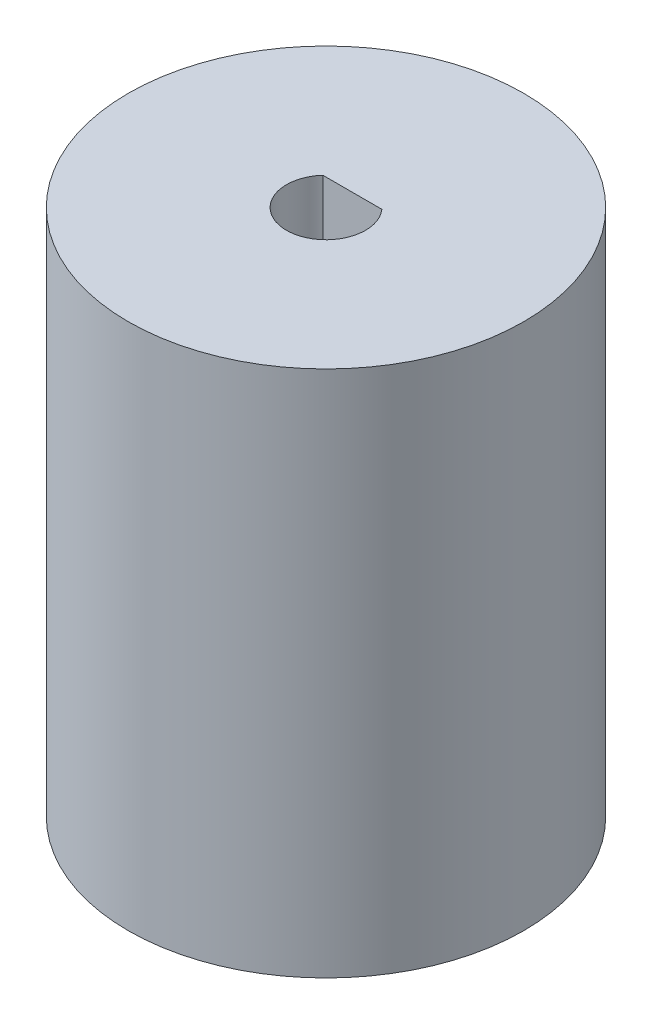
ISO-10303-21;
HEADER;
FILE_DESCRIPTION(('STEP AP214'),'2;1');
FILE_NAME('part.step','',(''),(''),'','','');
FILE_SCHEMA(('AUTOMOTIVE_DESIGN { 1 0 10303 214 1 1 1 1 }'));
ENDSEC;
DATA;
#1=APPLICATION_CONTEXT('core data for automotive mechanical design processes');
#2=APPLICATION_PROTOCOL_DEFINITION('international standard','automotive_design',2000,#1);
#3=PRODUCT_CONTEXT('',#1,'mechanical');
#4=PRODUCT('Part','Part','',(#3));
#5=PRODUCT_RELATED_PRODUCT_CATEGORY('part','',(#4));
#6=PRODUCT_DEFINITION_FORMATION('','',#4);
#7=PRODUCT_DEFINITION_CONTEXT('part definition',#1,'design');
#8=PRODUCT_DEFINITION('design','',#6,#7);
#9=PRODUCT_DEFINITION_SHAPE('','',#8);
#10=(LENGTH_UNIT() NAMED_UNIT(*) SI_UNIT(.MILLI.,.METRE.));
#11=(NAMED_UNIT(*) PLANE_ANGLE_UNIT() SI_UNIT($,.RADIAN.));
#12=(NAMED_UNIT(*) SI_UNIT($,.STERADIAN.) SOLID_ANGLE_UNIT());
#13=UNCERTAINTY_MEASURE_WITH_UNIT(LENGTH_MEASURE(1.E-05),#10,'distance_accuracy_value','');
#14=(GEOMETRIC_REPRESENTATION_CONTEXT(3) GLOBAL_UNCERTAINTY_ASSIGNED_CONTEXT((#13)) GLOBAL_UNIT_ASSIGNED_CONTEXT((#10,
#11,#12)) REPRESENTATION_CONTEXT('',''));
#15=CARTESIAN_POINT('',(0.,0.,0.));
#16=DIRECTION('',(0.,0.,1.));
#17=DIRECTION('',(1.,0.,0.));
#18=AXIS2_PLACEMENT_3D('',#15,#16,#17);
#19=CARTESIAN_POINT('',(0.,20.,0.247872528));
#20=DIRECTION('',(0.,0.,-1.));
#21=DIRECTION('',(-1.,0.,0.));
#22=AXIS2_PLACEMENT_3D('',#19,#20,#21);
#23=PLANE('',#22);
#24=DIRECTION('',(1.,0.,0.));
#25=VECTOR('',#24,1.);
#26=CARTESIAN_POINT('',(0.,0.,0.247872528));
#27=LINE('',#26,#25);
#28=CARTESIAN_POINT('',(-1.11803398874989,0.,0.247872528));
#29=VERTEX_POINT('',#28);
#30=CARTESIAN_POINT('',(1.1180339887499,0.,0.247872528));
#31=VERTEX_POINT('',#30);
#32=EDGE_CURVE('E59',#29,#31,#27,.T.);
#33=ORIENTED_EDGE('',*,*,#32,.T.);
#34=DIRECTION('',(0.,-1.,0.));
#35=VECTOR('',#34,1.);
#36=CARTESIAN_POINT('',(1.1180339887499,20.,0.247872528));
#37=LINE('',#36,#35);
#38=CARTESIAN_POINT('',(1.1180339887499,20.,0.247872528));
#39=VERTEX_POINT('',#38);
#40=EDGE_CURVE('E11',#39,#31,#37,.T.);
#41=ORIENTED_EDGE('',*,*,#40,.F.);
#42=DIRECTION('',(1.,0.,0.));
#43=VECTOR('',#42,1.);
#44=CARTESIAN_POINT('',(0.,20.,0.247872528));
#45=LINE('',#44,#43);
#46=CARTESIAN_POINT('',(-1.11803398874989,20.,0.247872528));
#47=VERTEX_POINT('',#46);
#48=EDGE_CURVE('E61',#47,#39,#45,.T.);
#49=ORIENTED_EDGE('',*,*,#48,.F.);
#50=DIRECTION('',(0.,-1.,0.));
#51=VECTOR('',#50,1.);
#52=CARTESIAN_POINT('',(-1.11803398874989,20.,0.247872528));
#53=LINE('',#52,#51);
#54=EDGE_CURVE('E43',#47,#29,#53,.T.);
#55=ORIENTED_EDGE('',*,*,#54,.T.);
#56=EDGE_LOOP('',(#33,#41,#49,#55));
#57=FACE_BOUND('',#56,.T.);
#58=ADVANCED_FACE('F35',(#57),#23,.F.);
#59=CARTESIAN_POINT('',(0.,20.,1.247872528));
#60=DIRECTION('',(0.,-1.,0.));
#61=DIRECTION('',(0.,0.,-1.));
#62=AXIS2_PLACEMENT_3D('',#59,#60,#61);
#63=CYLINDRICAL_SURFACE('',#62,1.5);
#64=CARTESIAN_POINT('',(0.,0.,1.247872528));
#65=DIRECTION('',(0.,1.,0.));
#66=DIRECTION('',(0.,0.,1.));
#67=AXIS2_PLACEMENT_3D('',#64,#65,#66);
#68=CIRCLE('',#67,1.5);
#69=EDGE_CURVE('E67',#29,#31,#68,.T.);
#70=ORIENTED_EDGE('',*,*,#69,.F.);
#71=ORIENTED_EDGE('',*,*,#54,.F.);
#72=CARTESIAN_POINT('',(0.,20.,1.247872528));
#73=DIRECTION('',(0.,1.,0.));
#74=DIRECTION('',(0.,0.,1.));
#75=AXIS2_PLACEMENT_3D('',#72,#73,#74);
#76=CIRCLE('',#75,1.5);
#77=EDGE_CURVE('E77',#47,#39,#76,.T.);
#78=ORIENTED_EDGE('',*,*,#77,.T.);
#79=ORIENTED_EDGE('',*,*,#40,.T.);
#80=EDGE_LOOP('',(#70,#71,#78,#79));
#81=FACE_BOUND('',#80,.T.);
#82=ADVANCED_FACE('F69',(#81),#63,.F.);
#83=CARTESIAN_POINT('',(0.,20.,1.247872528));
#84=DIRECTION('',(0.,-1.,0.));
#85=DIRECTION('',(0.,0.,-1.));
#86=AXIS2_PLACEMENT_3D('',#83,#84,#85);
#87=CYLINDRICAL_SURFACE('',#86,7.5);
#88=CARTESIAN_POINT('',(0.,20.,1.247872528));
#89=DIRECTION('',(0.,1.,0.));
#90=DIRECTION('',(0.,0.,1.));
#91=AXIS2_PLACEMENT_3D('',#88,#89,#90);
#92=CIRCLE('',#91,7.5);
#93=CARTESIAN_POINT('',(0.,20.,8.747872528));
#94=VERTEX_POINT('',#93);
#95=EDGE_CURVE('E63',#94,#94,#92,.T.);
#96=ORIENTED_EDGE('',*,*,#95,.F.);
#97=EDGE_LOOP('',(#96));
#98=FACE_BOUND('',#97,.T.);
#99=CARTESIAN_POINT('',(0.,0.,1.247872528));
#100=DIRECTION('',(0.,1.,0.));
#101=DIRECTION('',(0.,0.,1.));
#102=AXIS2_PLACEMENT_3D('',#99,#100,#101);
#103=CIRCLE('',#102,7.5);
#104=CARTESIAN_POINT('',(0.,0.,8.747872528));
#105=VERTEX_POINT('',#104);
#106=EDGE_CURVE('E70',#105,#105,#103,.T.);
#107=ORIENTED_EDGE('',*,*,#106,.T.);
#108=EDGE_LOOP('',(#107));
#109=FACE_BOUND('',#108,.T.);
#110=ADVANCED_FACE('F83',(#98,#109),#87,.T.);
#111=CARTESIAN_POINT('',(0.,20.,0.));
#112=DIRECTION('',(0.,1.,0.));
#113=DIRECTION('',(0.,0.,1.));
#114=AXIS2_PLACEMENT_3D('',#111,#112,#113);
#115=PLANE('',#114);
#116=ORIENTED_EDGE('',*,*,#48,.T.);
#117=ORIENTED_EDGE('',*,*,#77,.F.);
#118=EDGE_LOOP('',(#116,#117));
#119=FACE_BOUND('',#118,.T.);
#120=ORIENTED_EDGE('',*,*,#95,.T.);
#121=EDGE_LOOP('',(#120));
#122=FACE_BOUND('',#121,.T.);
#123=ADVANCED_FACE('F80',(#119,#122),#115,.T.);
#124=CARTESIAN_POINT('',(0.,0.,0.));
#125=DIRECTION('',(0.,1.,0.));
#126=DIRECTION('',(0.,0.,1.));
#127=AXIS2_PLACEMENT_3D('',#124,#125,#126);
#128=PLANE('',#127);
#129=ORIENTED_EDGE('',*,*,#32,.F.);
#130=ORIENTED_EDGE('',*,*,#69,.T.);
#131=EDGE_LOOP('',(#129,#130));
#132=FACE_BOUND('',#131,.T.);
#133=ORIENTED_EDGE('',*,*,#106,.F.);
#134=EDGE_LOOP('',(#133));
#135=FACE_BOUND('',#134,.T.);
#136=ADVANCED_FACE('F65',(#132,#135),#128,.F.);
#137=CLOSED_SHELL('',(#58,#82,#110,#123,#136));
#138=MANIFOLD_SOLID_BREP('B2',#137);
#139=ADVANCED_BREP_SHAPE_REPRESENTATION('',(#18,#138),#14);
#140=SHAPE_DEFINITION_REPRESENTATION(#9,#139);
ENDSEC;
END-ISO-10303-21;
